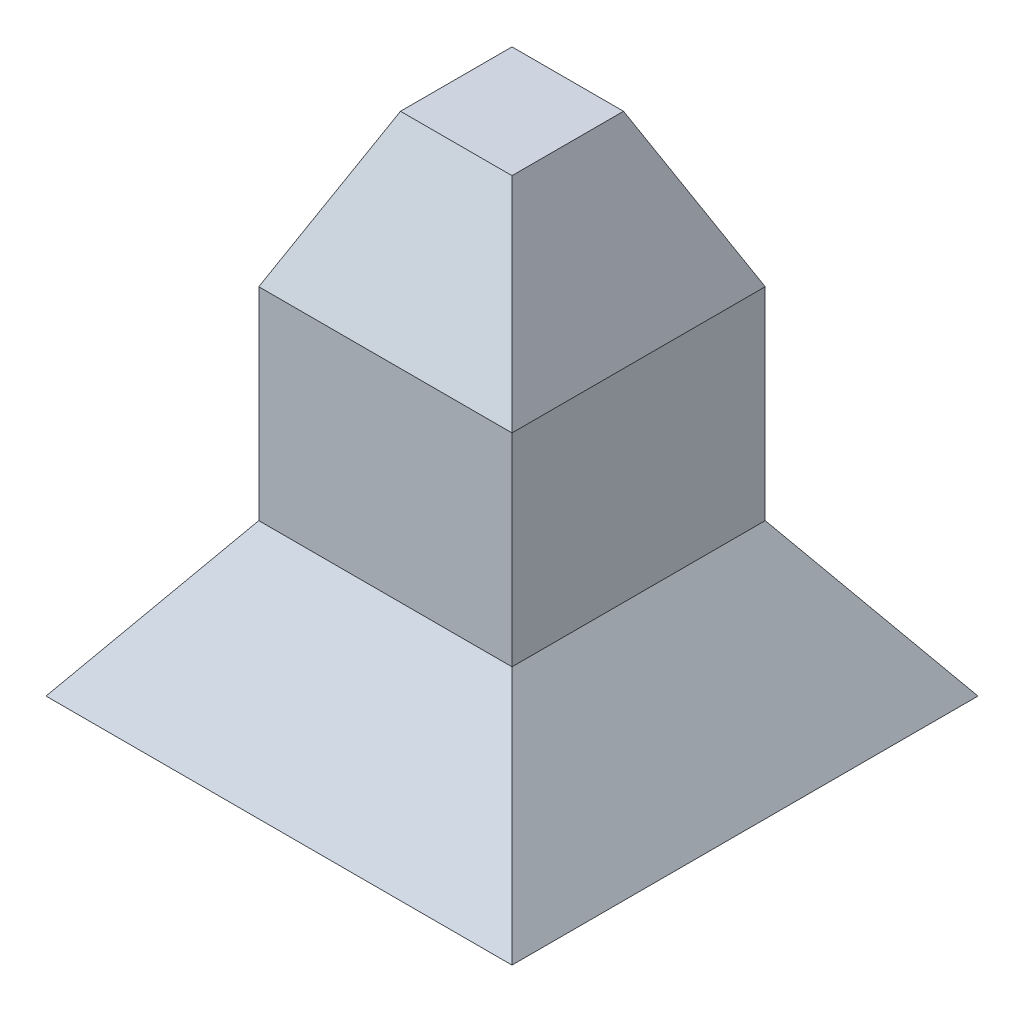
ISO-10303-21;
HEADER;
FILE_DESCRIPTION(('STEP AP214'),'2;1');
FILE_NAME('part.step','',(''),(''),'','','');
FILE_SCHEMA(('AUTOMOTIVE_DESIGN { 1 0 10303 214 1 1 1 1 }'));
ENDSEC;
DATA;
#1=APPLICATION_CONTEXT('core data for automotive mechanical design processes');
#2=APPLICATION_PROTOCOL_DEFINITION('international standard','automotive_design',2000,#1);
#3=PRODUCT_CONTEXT('',#1,'mechanical');
#4=PRODUCT('Part','Part','',(#3));
#5=PRODUCT_RELATED_PRODUCT_CATEGORY('part','',(#4));
#6=PRODUCT_DEFINITION_FORMATION('','',#4);
#7=PRODUCT_DEFINITION_CONTEXT('part definition',#1,'design');
#8=PRODUCT_DEFINITION('design','',#6,#7);
#9=PRODUCT_DEFINITION_SHAPE('','',#8);
#10=(LENGTH_UNIT() NAMED_UNIT(*) SI_UNIT(.MILLI.,.METRE.));
#11=(NAMED_UNIT(*) PLANE_ANGLE_UNIT() SI_UNIT($,.RADIAN.));
#12=(NAMED_UNIT(*) SI_UNIT($,.STERADIAN.) SOLID_ANGLE_UNIT());
#13=UNCERTAINTY_MEASURE_WITH_UNIT(LENGTH_MEASURE(1.E-05),#10,'distance_accuracy_value','');
#14=(GEOMETRIC_REPRESENTATION_CONTEXT(3) GLOBAL_UNCERTAINTY_ASSIGNED_CONTEXT((#13)) GLOBAL_UNIT_ASSIGNED_CONTEXT((#10,
#11,#12)) REPRESENTATION_CONTEXT('',''));
#15=CARTESIAN_POINT('',(0.,0.,0.));
#16=DIRECTION('',(0.,0.,1.));
#17=DIRECTION('',(1.,0.,0.));
#18=AXIS2_PLACEMENT_3D('',#15,#16,#17);
#19=CARTESIAN_POINT('',(-50.,80.,-49.9999999999998));
#20=DIRECTION('',(0.,0.,1.));
#21=DIRECTION('',(1.,0.,0.));
#22=AXIS2_PLACEMENT_3D('',#19,#20,#21);
#23=PLANE('',#22);
#24=DIRECTION('',(-1.,0.,0.));
#25=VECTOR('',#24,1.);
#26=CARTESIAN_POINT('',(-50.,0.,-49.9999999999998));
#27=LINE('',#26,#25);
#28=CARTESIAN_POINT('',(50.,0.,-49.9999999999998));
#29=VERTEX_POINT('',#28);
#30=CARTESIAN_POINT('',(-50.,0.,-49.9999999999998));
#31=VERTEX_POINT('',#30);
#32=EDGE_CURVE('E243',#29,#31,#27,.T.);
#33=ORIENTED_EDGE('',*,*,#32,.T.);
#34=DIRECTION('',(0.,-1.,0.));
#35=VECTOR('',#34,1.);
#36=CARTESIAN_POINT('',(-50.,80.,-49.9999999999998));
#37=LINE('',#36,#35);
#38=CARTESIAN_POINT('',(-50.,80.,-49.9999999999998));
#39=VERTEX_POINT('',#38);
#40=EDGE_CURVE('E43',#39,#31,#37,.T.);
#41=ORIENTED_EDGE('',*,*,#40,.F.);
#42=DIRECTION('',(-1.,0.,0.));
#43=VECTOR('',#42,1.);
#44=CARTESIAN_POINT('',(-50.,80.,-49.9999999999998));
#45=LINE('',#44,#43);
#46=CARTESIAN_POINT('',(50.,80.,-49.9999999999998));
#47=VERTEX_POINT('',#46);
#48=EDGE_CURVE('E230',#47,#39,#45,.T.);
#49=ORIENTED_EDGE('',*,*,#48,.F.);
#50=DIRECTION('',(0.,-1.,0.));
#51=VECTOR('',#50,1.);
#52=CARTESIAN_POINT('',(50.,80.,-49.9999999999998));
#53=LINE('',#52,#51);
#54=EDGE_CURVE('E11',#47,#29,#53,.T.);
#55=ORIENTED_EDGE('',*,*,#54,.T.);
#56=EDGE_LOOP('',(#33,#41,#49,#55));
#57=FACE_BOUND('',#56,.T.);
#58=DIRECTION('',(0.,1.,0.));
#59=VECTOR('',#58,1.);
#60=CARTESIAN_POINT('',(-15.,25.,-49.9999999999998));
#61=LINE('',#60,#59);
#62=CARTESIAN_POINT('',(-15.,25.,-49.9999999999998));
#63=VERTEX_POINT('',#62);
#64=CARTESIAN_POINT('',(-15.,55.,-49.9999999999998));
#65=VERTEX_POINT('',#64);
#66=EDGE_CURVE('E69',#63,#65,#61,.T.);
#67=ORIENTED_EDGE('',*,*,#66,.F.);
#68=DIRECTION('',(-1.,0.,0.));
#69=VECTOR('',#68,1.);
#70=CARTESIAN_POINT('',(15.,25.,-49.9999999999998));
#71=LINE('',#70,#69);
#72=CARTESIAN_POINT('',(15.,25.,-49.9999999999998));
#73=VERTEX_POINT('',#72);
#74=EDGE_CURVE('E146',#73,#63,#71,.T.);
#75=ORIENTED_EDGE('',*,*,#74,.F.);
#76=DIRECTION('',(0.,-1.,0.));
#77=VECTOR('',#76,1.);
#78=CARTESIAN_POINT('',(15.,25.,-49.9999999999998));
#79=LINE('',#78,#77);
#80=CARTESIAN_POINT('',(15.,55.,-49.9999999999998));
#81=VERTEX_POINT('',#80);
#82=EDGE_CURVE('E148',#81,#73,#79,.T.);
#83=ORIENTED_EDGE('',*,*,#82,.F.);
#84=DIRECTION('',(1.,0.,0.));
#85=VECTOR('',#84,1.);
#86=CARTESIAN_POINT('',(15.,55.,-49.9999999999998));
#87=LINE('',#86,#85);
#88=EDGE_CURVE('E52',#65,#81,#87,.T.);
#89=ORIENTED_EDGE('',*,*,#88,.F.);
#90=EDGE_LOOP('',(#67,#75,#83,#89));
#91=FACE_BOUND('',#90,.T.);
#92=ADVANCED_FACE('F33',(#57,#91),#23,.F.);
#93=CARTESIAN_POINT('',(50.,80.,50.0000000000003));
#94=DIRECTION('',(-1.,0.,0.));
#95=DIRECTION('',(0.,0.,1.));
#96=AXIS2_PLACEMENT_3D('',#93,#94,#95);
#97=PLANE('',#96);
#98=DIRECTION('',(0.,0.,-1.));
#99=VECTOR('',#98,1.);
#100=CARTESIAN_POINT('',(50.,0.,50.0000000000003));
#101=LINE('',#100,#99);
#102=CARTESIAN_POINT('',(50.,0.,50.0000000000003));
#103=VERTEX_POINT('',#102);
#104=EDGE_CURVE('E209',#103,#29,#101,.T.);
#105=ORIENTED_EDGE('',*,*,#104,.T.);
#106=ORIENTED_EDGE('',*,*,#54,.F.);
#107=DIRECTION('',(0.,0.,-1.));
#108=VECTOR('',#107,1.);
#109=CARTESIAN_POINT('',(50.,80.,50.0000000000003));
#110=LINE('',#109,#108);
#111=CARTESIAN_POINT('',(50.,80.,50.0000000000003));
#112=VERTEX_POINT('',#111);
#113=EDGE_CURVE('E227',#112,#47,#110,.T.);
#114=ORIENTED_EDGE('',*,*,#113,.F.);
#115=DIRECTION('',(0.,-1.,0.));
#116=VECTOR('',#115,1.);
#117=CARTESIAN_POINT('',(50.,80.,50.0000000000003));
#118=LINE('',#117,#116);
#119=EDGE_CURVE('E240',#112,#103,#118,.T.);
#120=ORIENTED_EDGE('',*,*,#119,.T.);
#121=EDGE_LOOP('',(#105,#106,#114,#120));
#122=FACE_BOUND('',#121,.T.);
#123=ADVANCED_FACE('F295',(#122),#97,.F.);
#124=CARTESIAN_POINT('',(-50.,80.,50.0000000000003));
#125=DIRECTION('',(1.,0.,0.));
#126=DIRECTION('',(0.,0.,-1.));
#127=AXIS2_PLACEMENT_3D('',#124,#125,#126);
#128=PLANE('',#127);
#129=DIRECTION('',(0.,0.,1.));
#130=VECTOR('',#129,1.);
#131=CARTESIAN_POINT('',(-50.,0.,50.0000000000003));
#132=LINE('',#131,#130);
#133=CARTESIAN_POINT('',(-50.,0.,50.0000000000003));
#134=VERTEX_POINT('',#133);
#135=EDGE_CURVE('E246',#31,#134,#132,.T.);
#136=ORIENTED_EDGE('',*,*,#135,.T.);
#137=DIRECTION('',(0.,-1.,0.));
#138=VECTOR('',#137,1.);
#139=CARTESIAN_POINT('',(-50.,80.,50.0000000000003));
#140=LINE('',#139,#138);
#141=CARTESIAN_POINT('',(-50.,80.,50.0000000000003));
#142=VERTEX_POINT('',#141);
#143=EDGE_CURVE('E253',#142,#134,#140,.T.);
#144=ORIENTED_EDGE('',*,*,#143,.F.);
#145=DIRECTION('',(0.,0.,1.));
#146=VECTOR('',#145,1.);
#147=CARTESIAN_POINT('',(-50.,80.,50.0000000000003));
#148=LINE('',#147,#146);
#149=EDGE_CURVE('E234',#39,#142,#148,.T.);
#150=ORIENTED_EDGE('',*,*,#149,.F.);
#151=ORIENTED_EDGE('',*,*,#40,.T.);
#152=EDGE_LOOP('',(#136,#144,#150,#151));
#153=FACE_BOUND('',#152,.T.);
#154=ADVANCED_FACE('F301',(#153),#128,.F.);
#155=CARTESIAN_POINT('',(-50.,80.,50.0000000000003));
#156=DIRECTION('',(0.,0.,-1.));
#157=DIRECTION('',(-1.,0.,0.));
#158=AXIS2_PLACEMENT_3D('',#155,#156,#157);
#159=PLANE('',#158);
#160=DIRECTION('',(1.,0.,0.));
#161=VECTOR('',#160,1.);
#162=CARTESIAN_POINT('',(-50.,0.,50.0000000000003));
#163=LINE('',#162,#161);
#164=EDGE_CURVE('E231',#134,#103,#163,.T.);
#165=ORIENTED_EDGE('',*,*,#164,.T.);
#166=ORIENTED_EDGE('',*,*,#119,.F.);
#167=DIRECTION('',(1.,0.,0.));
#168=VECTOR('',#167,1.);
#169=CARTESIAN_POINT('',(-50.,80.,50.0000000000003));
#170=LINE('',#169,#168);
#171=EDGE_CURVE('E237',#142,#112,#170,.T.);
#172=ORIENTED_EDGE('',*,*,#171,.F.);
#173=ORIENTED_EDGE('',*,*,#143,.T.);
#174=EDGE_LOOP('',(#165,#166,#172,#173));
#175=FACE_BOUND('',#174,.T.);
#176=ADVANCED_FACE('F371',(#175),#159,.F.);
#177=CARTESIAN_POINT('',(-50.,80.,50.0000000000003));
#178=DIRECTION('',(0.,0.4226182617407,0.90630778703665));
#179=DIRECTION('',(0.,-0.90630778703665,0.4226182617407));
#180=AXIS2_PLACEMENT_3D('',#177,#178,#179);
#181=PLANE('',#180);
#182=ORIENTED_EDGE('',*,*,#171,.T.);
#183=DIRECTION('',(0.389281620635026,-0.834817129478987,0.389281620635026));
#184=VECTOR('',#183,1.);
#185=CARTESIAN_POINT('',(50.,80.,50.0000000000003));
#186=LINE('',#185,#184);
#187=CARTESIAN_POINT('',(22.0215405107,140.,22.0215405107003));
#188=VERTEX_POINT('',#187);
#189=EDGE_CURVE('E206',#188,#112,#186,.T.);
#190=ORIENTED_EDGE('',*,*,#189,.F.);
#191=DIRECTION('',(-1.,0.,0.));
#192=VECTOR('',#191,1.);
#193=CARTESIAN_POINT('',(-50.,140.,22.0215405107003));
#194=LINE('',#193,#192);
#195=CARTESIAN_POINT('',(-22.0215405107,140.,22.0215405107003));
#196=VERTEX_POINT('',#195);
#197=EDGE_CURVE('E187',#196,#188,#194,.F.);
#198=ORIENTED_EDGE('',*,*,#197,.F.);
#199=DIRECTION('',(-0.389281620635026,-0.834817129478987,0.389281620635026));
#200=VECTOR('',#199,1.);
#201=CARTESIAN_POINT('',(-50.,80.,50.0000000000003));
#202=LINE('',#201,#200);
#203=EDGE_CURVE('E211',#196,#142,#202,.T.);
#204=ORIENTED_EDGE('',*,*,#203,.T.);
#205=EDGE_LOOP('',(#182,#190,#198,#204));
#206=FACE_BOUND('',#205,.T.);
#207=ADVANCED_FACE('F367',(#206),#181,.T.);
#208=CARTESIAN_POINT('',(50.,80.,50.0000000000003));
#209=DIRECTION('',(0.90630778703665,0.4226182617407,0.));
#210=DIRECTION('',(-0.4226182617407,0.90630778703665,0.));
#211=AXIS2_PLACEMENT_3D('',#208,#209,#210);
#212=PLANE('',#211);
#213=ORIENTED_EDGE('',*,*,#113,.T.);
#214=DIRECTION('',(0.389281620635026,-0.834817129478987,-0.389281620635026));
#215=VECTOR('',#214,1.);
#216=CARTESIAN_POINT('',(50.,80.,-49.9999999999998));
#217=LINE('',#216,#215);
#218=CARTESIAN_POINT('',(22.0215405107,140.,-22.0215405106998));
#219=VERTEX_POINT('',#218);
#220=EDGE_CURVE('E210',#219,#47,#217,.T.);
#221=ORIENTED_EDGE('',*,*,#220,.F.);
#222=DIRECTION('',(0.,0.,1.));
#223=VECTOR('',#222,1.);
#224=CARTESIAN_POINT('',(22.0215405107,140.,50.0000000000003));
#225=LINE('',#224,#223);
#226=EDGE_CURVE('E222',#188,#219,#225,.F.);
#227=ORIENTED_EDGE('',*,*,#226,.F.);
#228=ORIENTED_EDGE('',*,*,#189,.T.);
#229=EDGE_LOOP('',(#213,#221,#227,#228));
#230=FACE_BOUND('',#229,.T.);
#231=ADVANCED_FACE('F370',(#230),#212,.T.);
#232=CARTESIAN_POINT('',(50.,80.,-49.9999999999998));
#233=DIRECTION('',(0.,0.4226182617407,-0.90630778703665));
#234=DIRECTION('',(0.,0.90630778703665,0.4226182617407));
#235=AXIS2_PLACEMENT_3D('',#232,#233,#234);
#236=PLANE('',#235);
#237=ORIENTED_EDGE('',*,*,#48,.T.);
#238=DIRECTION('',(-0.389281620635026,-0.834817129478987,-0.389281620635026));
#239=VECTOR('',#238,1.);
#240=CARTESIAN_POINT('',(-50.,80.,-49.9999999999998));
#241=LINE('',#240,#239);
#242=CARTESIAN_POINT('',(-22.0215405107,140.,-22.0215405106998));
#243=VERTEX_POINT('',#242);
#244=EDGE_CURVE('E214',#243,#39,#241,.T.);
#245=ORIENTED_EDGE('',*,*,#244,.F.);
#246=DIRECTION('',(1.,0.,0.));
#247=VECTOR('',#246,1.);
#248=CARTESIAN_POINT('',(50.,140.,-22.0215405106998));
#249=LINE('',#248,#247);
#250=EDGE_CURVE('E224',#219,#243,#249,.F.);
#251=ORIENTED_EDGE('',*,*,#250,.F.);
#252=ORIENTED_EDGE('',*,*,#220,.T.);
#253=EDGE_LOOP('',(#237,#245,#251,#252));
#254=FACE_BOUND('',#253,.T.);
#255=ADVANCED_FACE('F375',(#254),#236,.T.);
#256=CARTESIAN_POINT('',(-50.,80.,-49.9999999999998));
#257=DIRECTION('',(-0.90630778703665,0.4226182617407,0.));
#258=DIRECTION('',(-0.4226182617407,-0.90630778703665,0.));
#259=AXIS2_PLACEMENT_3D('',#256,#257,#258);
#260=PLANE('',#259);
#261=ORIENTED_EDGE('',*,*,#149,.T.);
#262=ORIENTED_EDGE('',*,*,#203,.F.);
#263=DIRECTION('',(0.,0.,-1.));
#264=VECTOR('',#263,1.);
#265=CARTESIAN_POINT('',(-22.0215405107,140.,-49.9999999999998));
#266=LINE('',#265,#264);
#267=EDGE_CURVE('E215',#243,#196,#266,.F.);
#268=ORIENTED_EDGE('',*,*,#267,.F.);
#269=ORIENTED_EDGE('',*,*,#244,.T.);
#270=EDGE_LOOP('',(#261,#262,#268,#269));
#271=FACE_BOUND('',#270,.T.);
#272=ADVANCED_FACE('F365',(#271),#260,.T.);
#273=CARTESIAN_POINT('',(0.,140.,0.));
#274=DIRECTION('',(0.,1.,0.));
#275=DIRECTION('',(0.,0.,1.));
#276=AXIS2_PLACEMENT_3D('',#273,#274,#275);
#277=PLANE('',#276);
#278=ORIENTED_EDGE('',*,*,#197,.T.);
#279=ORIENTED_EDGE('',*,*,#226,.T.);
#280=ORIENTED_EDGE('',*,*,#250,.T.);
#281=ORIENTED_EDGE('',*,*,#267,.T.);
#282=EDGE_LOOP('',(#278,#279,#280,#281));
#283=FACE_BOUND('',#282,.T.);
#284=ADVANCED_FACE('F351',(#283),#277,.T.);
#285=CARTESIAN_POINT('',(-50.,0.,-49.9999999999998));
#286=DIRECTION('',(0.,0.573576436351047,-0.819152044288991));
#287=DIRECTION('',(0.,0.819152044288991,0.573576436351047));
#288=AXIS2_PLACEMENT_3D('',#285,#286,#287);
#289=PLANE('',#288);
#290=ORIENTED_EDGE('',*,*,#32,.F.);
#291=DIRECTION('',(-0.497542812164524,0.710564775461629,0.497542812164524));
#292=VECTOR('',#291,1.);
#293=CARTESIAN_POINT('',(50.,0.,-49.9999999999998));
#294=LINE('',#293,#292);
#295=CARTESIAN_POINT('',(92.0124522925827,-60.,-92.0124522925825));
#296=VERTEX_POINT('',#295);
#297=EDGE_CURVE('E185',#296,#29,#294,.T.);
#298=ORIENTED_EDGE('',*,*,#297,.F.);
#299=DIRECTION('',(-1.,0.,0.));
#300=VECTOR('',#299,1.);
#301=CARTESIAN_POINT('',(-50.,-60.,-92.0124522925825));
#302=LINE('',#301,#300);
#303=CARTESIAN_POINT('',(-92.0124522925828,-60.,-92.0124522925825));
#304=VERTEX_POINT('',#303);
#305=EDGE_CURVE('E197',#304,#296,#302,.F.);
#306=ORIENTED_EDGE('',*,*,#305,.F.);
#307=DIRECTION('',(0.497542812164524,0.710564775461629,0.497542812164524));
#308=VECTOR('',#307,1.);
#309=CARTESIAN_POINT('',(-50.,0.,-49.9999999999998));
#310=LINE('',#309,#308);
#311=EDGE_CURVE('E189',#304,#31,#310,.T.);
#312=ORIENTED_EDGE('',*,*,#311,.T.);
#313=EDGE_LOOP('',(#290,#298,#306,#312));
#314=FACE_BOUND('',#313,.T.);
#315=ADVANCED_FACE('F347',(#314),#289,.T.);
#316=CARTESIAN_POINT('',(50.,0.,-49.9999999999998));
#317=DIRECTION('',(0.819152044288991,0.573576436351047,0.));
#318=DIRECTION('',(-0.573576436351047,0.819152044288991,0.));
#319=AXIS2_PLACEMENT_3D('',#316,#317,#318);
#320=PLANE('',#319);
#321=ORIENTED_EDGE('',*,*,#104,.F.);
#322=DIRECTION('',(-0.497542812164524,0.710564775461629,-0.497542812164524));
#323=VECTOR('',#322,1.);
#324=CARTESIAN_POINT('',(50.,0.,50.0000000000003));
#325=LINE('',#324,#323);
#326=CARTESIAN_POINT('',(92.0124522925827,-60.,92.012452292583));
#327=VERTEX_POINT('',#326);
#328=EDGE_CURVE('E188',#327,#103,#325,.T.);
#329=ORIENTED_EDGE('',*,*,#328,.F.);
#330=DIRECTION('',(0.,0.,-1.));
#331=VECTOR('',#330,1.);
#332=CARTESIAN_POINT('',(92.0124522925827,-60.,-49.9999999999998));
#333=LINE('',#332,#331);
#334=EDGE_CURVE('E200',#296,#327,#333,.F.);
#335=ORIENTED_EDGE('',*,*,#334,.F.);
#336=ORIENTED_EDGE('',*,*,#297,.T.);
#337=EDGE_LOOP('',(#321,#329,#335,#336));
#338=FACE_BOUND('',#337,.T.);
#339=ADVANCED_FACE('F350',(#338),#320,.T.);
#340=CARTESIAN_POINT('',(50.,0.,50.0000000000003));
#341=DIRECTION('',(0.,0.573576436351047,0.819152044288991));
#342=DIRECTION('',(0.,-0.819152044288991,0.573576436351047));
#343=AXIS2_PLACEMENT_3D('',#340,#341,#342);
#344=PLANE('',#343);
#345=ORIENTED_EDGE('',*,*,#164,.F.);
#346=DIRECTION('',(0.497542812164524,0.710564775461629,-0.497542812164524));
#347=VECTOR('',#346,1.);
#348=CARTESIAN_POINT('',(-50.,0.,50.0000000000003));
#349=LINE('',#348,#347);
#350=CARTESIAN_POINT('',(-92.0124522925828,-60.,92.012452292583));
#351=VERTEX_POINT('',#350);
#352=EDGE_CURVE('E191',#351,#134,#349,.T.);
#353=ORIENTED_EDGE('',*,*,#352,.F.);
#354=DIRECTION('',(1.,0.,0.));
#355=VECTOR('',#354,1.);
#356=CARTESIAN_POINT('',(50.,-60.,92.012452292583));
#357=LINE('',#356,#355);
#358=EDGE_CURVE('E203',#327,#351,#357,.F.);
#359=ORIENTED_EDGE('',*,*,#358,.F.);
#360=ORIENTED_EDGE('',*,*,#328,.T.);
#361=EDGE_LOOP('',(#345,#353,#359,#360));
#362=FACE_BOUND('',#361,.T.);
#363=ADVANCED_FACE('F355',(#362),#344,.T.);
#364=CARTESIAN_POINT('',(-50.,0.,50.0000000000003));
#365=DIRECTION('',(-0.819152044288991,0.573576436351047,0.));
#366=DIRECTION('',(-0.573576436351047,-0.819152044288991,0.));
#367=AXIS2_PLACEMENT_3D('',#364,#365,#366);
#368=PLANE('',#367);
#369=ORIENTED_EDGE('',*,*,#135,.F.);
#370=ORIENTED_EDGE('',*,*,#311,.F.);
#371=DIRECTION('',(0.,0.,1.));
#372=VECTOR('',#371,1.);
#373=CARTESIAN_POINT('',(-92.0124522925828,-60.,50.0000000000003));
#374=LINE('',#373,#372);
#375=EDGE_CURVE('E192',#351,#304,#374,.F.);
#376=ORIENTED_EDGE('',*,*,#375,.F.);
#377=ORIENTED_EDGE('',*,*,#352,.T.);
#378=EDGE_LOOP('',(#369,#370,#376,#377));
#379=FACE_BOUND('',#378,.T.);
#380=ADVANCED_FACE('F346',(#379),#368,.T.);
#381=CARTESIAN_POINT('',(0.,-60.,0.));
#382=DIRECTION('',(0.,-1.,0.));
#383=DIRECTION('',(0.,0.,-1.));
#384=AXIS2_PLACEMENT_3D('',#381,#382,#383);
#385=PLANE('',#384);
#386=DIRECTION('',(0.,0.,-1.));
#387=VECTOR('',#386,1.);
#388=CARTESIAN_POINT('',(86.0166030567772,-60.,0.));
#389=LINE('',#388,#387);
#390=CARTESIAN_POINT('',(86.0166030567772,-60.,-86.0166030567772));
#391=VERTEX_POINT('',#390);
#392=CARTESIAN_POINT('',(86.0166030567772,-60.,86.0166030567772));
#393=VERTEX_POINT('',#392);
#394=EDGE_CURVE('E273',#391,#393,#389,.F.);
#395=ORIENTED_EDGE('',*,*,#394,.F.);
#396=DIRECTION('',(-1.,0.,0.));
#397=VECTOR('',#396,1.);
#398=CARTESIAN_POINT('',(0.,-60.,-86.0166030567772));
#399=LINE('',#398,#397);
#400=CARTESIAN_POINT('',(-86.0166030567772,-60.,-86.0166030567772));
#401=VERTEX_POINT('',#400);
#402=EDGE_CURVE('E175',#401,#391,#399,.F.);
#403=ORIENTED_EDGE('',*,*,#402,.F.);
#404=DIRECTION('',(0.,0.,1.));
#405=VECTOR('',#404,1.);
#406=CARTESIAN_POINT('',(-86.0166030567772,-60.,0.));
#407=LINE('',#406,#405);
#408=CARTESIAN_POINT('',(-86.0166030567772,-60.,86.0166030567772));
#409=VERTEX_POINT('',#408);
#410=EDGE_CURVE('E267',#409,#401,#407,.F.);
#411=ORIENTED_EDGE('',*,*,#410,.F.);
#412=DIRECTION('',(1.,0.,0.));
#413=VECTOR('',#412,1.);
#414=CARTESIAN_POINT('',(0.,-60.,86.0166030567772));
#415=LINE('',#414,#413);
#416=EDGE_CURVE('E270',#393,#409,#415,.F.);
#417=ORIENTED_EDGE('',*,*,#416,.F.);
#418=EDGE_LOOP('',(#395,#403,#411,#417));
#419=FACE_BOUND('',#418,.T.);
#420=ORIENTED_EDGE('',*,*,#305,.T.);
#421=ORIENTED_EDGE('',*,*,#334,.T.);
#422=ORIENTED_EDGE('',*,*,#358,.T.);
#423=ORIENTED_EDGE('',*,*,#375,.T.);
#424=EDGE_LOOP('',(#420,#421,#422,#423));
#425=FACE_BOUND('',#424,.T.);
#426=ADVANCED_FACE('F315',(#419,#425),#385,.T.);
#427=CARTESIAN_POINT('',(72.012452292583,-40.,-72.012452292583));
#428=DIRECTION('',(-0.819152044288991,-0.573576436351047,0.));
#429=DIRECTION('',(0.573576436351047,-0.819152044288991,0.));
#430=AXIS2_PLACEMENT_3D('',#427,#428,#429);
#431=PLANE('',#430);
#432=ORIENTED_EDGE('',*,*,#394,.T.);
#433=DIRECTION('',(0.497542812164524,-0.710564775461629,0.497542812164524));
#434=VECTOR('',#433,1.);
#435=CARTESIAN_POINT('',(36.3592528002991,10.918045788884,36.3592528002991));
#436=LINE('',#435,#434);
#437=CARTESIAN_POINT('',(72.012452292583,-40.,72.012452292583));
#438=VERTEX_POINT('',#437);
#439=EDGE_CURVE('E184',#438,#393,#436,.T.);
#440=ORIENTED_EDGE('',*,*,#439,.F.);
#441=DIRECTION('',(0.,0.,1.));
#442=VECTOR('',#441,1.);
#443=CARTESIAN_POINT('',(72.012452292583,-40.,-72.012452292583));
#444=LINE('',#443,#442);
#445=CARTESIAN_POINT('',(72.012452292583,-40.,-72.012452292583));
#446=VERTEX_POINT('',#445);
#447=EDGE_CURVE('E171',#446,#438,#444,.T.);
#448=ORIENTED_EDGE('',*,*,#447,.F.);
#449=DIRECTION('',(0.497542812164524,-0.710564775461629,-0.497542812164524));
#450=VECTOR('',#449,1.);
#451=CARTESIAN_POINT('',(36.3592528002991,10.918045788884,-36.3592528002991));
#452=LINE('',#451,#450);
#453=EDGE_CURVE('E201',#446,#391,#452,.T.);
#454=ORIENTED_EDGE('',*,*,#453,.T.);
#455=EDGE_LOOP('',(#432,#440,#448,#454));
#456=FACE_BOUND('',#455,.T.);
#457=ADVANCED_FACE('F311',(#456),#431,.T.);
#458=CARTESIAN_POINT('',(-72.012452292583,-40.,-72.012452292583));
#459=DIRECTION('',(0.,-0.573576436351047,0.819152044288991));
#460=DIRECTION('',(0.,-0.819152044288991,-0.573576436351047));
#461=AXIS2_PLACEMENT_3D('',#458,#459,#460);
#462=PLANE('',#461);
#463=ORIENTED_EDGE('',*,*,#402,.T.);
#464=ORIENTED_EDGE('',*,*,#453,.F.);
#465=DIRECTION('',(1.,0.,0.));
#466=VECTOR('',#465,1.);
#467=CARTESIAN_POINT('',(-72.012452292583,-40.,-72.012452292583));
#468=LINE('',#467,#466);
#469=CARTESIAN_POINT('',(-72.012452292583,-40.,-72.012452292583));
#470=VERTEX_POINT('',#469);
#471=EDGE_CURVE('E181',#470,#446,#468,.T.);
#472=ORIENTED_EDGE('',*,*,#471,.F.);
#473=DIRECTION('',(-0.497542812164524,-0.710564775461629,-0.497542812164524));
#474=VECTOR('',#473,1.);
#475=CARTESIAN_POINT('',(-72.012452292583,-40.,-72.012452292583));
#476=LINE('',#475,#474);
#477=EDGE_CURVE('E259',#470,#401,#476,.T.);
#478=ORIENTED_EDGE('',*,*,#477,.T.);
#479=EDGE_LOOP('',(#463,#464,#472,#478));
#480=FACE_BOUND('',#479,.T.);
#481=ADVANCED_FACE('F307',(#480),#462,.T.);
#482=CARTESIAN_POINT('',(-72.012452292583,-40.,-72.012452292583));
#483=DIRECTION('',(0.819152044288991,-0.573576436351047,0.));
#484=DIRECTION('',(0.573576436351047,0.819152044288991,0.));
#485=AXIS2_PLACEMENT_3D('',#482,#483,#484);
#486=PLANE('',#485);
#487=ORIENTED_EDGE('',*,*,#410,.T.);
#488=ORIENTED_EDGE('',*,*,#477,.F.);
#489=DIRECTION('',(0.,0.,-1.));
#490=VECTOR('',#489,1.);
#491=CARTESIAN_POINT('',(-72.012452292583,-40.,-72.012452292583));
#492=LINE('',#491,#490);
#493=CARTESIAN_POINT('',(-72.012452292583,-40.,72.012452292583));
#494=VERTEX_POINT('',#493);
#495=EDGE_CURVE('E178',#494,#470,#492,.T.);
#496=ORIENTED_EDGE('',*,*,#495,.F.);
#497=DIRECTION('',(-0.497542812164524,-0.710564775461629,0.497542812164524));
#498=VECTOR('',#497,1.);
#499=CARTESIAN_POINT('',(-72.012452292583,-40.,72.012452292583));
#500=LINE('',#499,#498);
#501=EDGE_CURVE('E261',#494,#409,#500,.T.);
#502=ORIENTED_EDGE('',*,*,#501,.T.);
#503=EDGE_LOOP('',(#487,#488,#496,#502));
#504=FACE_BOUND('',#503,.T.);
#505=ADVANCED_FACE('F310',(#504),#486,.T.);
#506=CARTESIAN_POINT('',(-72.012452292583,-40.,72.012452292583));
#507=DIRECTION('',(0.,-0.573576436351047,-0.819152044288991));
#508=DIRECTION('',(0.,0.819152044288991,-0.573576436351047));
#509=AXIS2_PLACEMENT_3D('',#506,#507,#508);
#510=PLANE('',#509);
#511=ORIENTED_EDGE('',*,*,#416,.T.);
#512=ORIENTED_EDGE('',*,*,#501,.F.);
#513=DIRECTION('',(-1.,0.,0.));
#514=VECTOR('',#513,1.);
#515=CARTESIAN_POINT('',(-72.012452292583,-40.,72.012452292583));
#516=LINE('',#515,#514);
#517=EDGE_CURVE('E174',#438,#494,#516,.T.);
#518=ORIENTED_EDGE('',*,*,#517,.F.);
#519=ORIENTED_EDGE('',*,*,#439,.T.);
#520=EDGE_LOOP('',(#511,#512,#518,#519));
#521=FACE_BOUND('',#520,.T.);
#522=ADVANCED_FACE('F317',(#521),#510,.T.);
#523=CARTESIAN_POINT('',(0.,-40.,0.));
#524=DIRECTION('',(0.,1.,0.));
#525=DIRECTION('',(0.,0.,1.));
#526=AXIS2_PLACEMENT_3D('',#523,#524,#525);
#527=PLANE('',#526);
#528=ORIENTED_EDGE('',*,*,#447,.T.);
#529=ORIENTED_EDGE('',*,*,#517,.T.);
#530=ORIENTED_EDGE('',*,*,#495,.T.);
#531=ORIENTED_EDGE('',*,*,#471,.T.);
#532=EDGE_LOOP('',(#528,#529,#530,#531));
#533=FACE_BOUND('',#532,.T.);
#534=ADVANCED_FACE('F319',(#533),#527,.F.);
#535=CARTESIAN_POINT('',(-15.,25.,-69.9999999999998));
#536=DIRECTION('',(1.,0.,0.));
#537=DIRECTION('',(0.,0.,-1.));
#538=AXIS2_PLACEMENT_3D('',#535,#536,#537);
#539=PLANE('',#538);
#540=ORIENTED_EDGE('',*,*,#66,.T.);
#541=DIRECTION('',(0.,-0.342020143325669,-0.939692620785908));
#542=VECTOR('',#541,1.);
#543=CARTESIAN_POINT('',(-15.,55.,-49.9999999999998));
#544=LINE('',#543,#542);
#545=CARTESIAN_POINT('',(-15.,47.7205953146759,-69.9999999999998));
#546=VERTEX_POINT('',#545);
#547=EDGE_CURVE('E168',#546,#65,#544,.F.);
#548=ORIENTED_EDGE('',*,*,#547,.F.);
#549=DIRECTION('',(0.,1.,0.));
#550=VECTOR('',#549,1.);
#551=CARTESIAN_POINT('',(-15.,25.,-69.9999999999998));
#552=LINE('',#551,#550);
#553=CARTESIAN_POINT('',(-15.,25.,-69.9999999999998));
#554=VERTEX_POINT('',#553);
#555=EDGE_CURVE('E153',#554,#546,#552,.T.);
#556=ORIENTED_EDGE('',*,*,#555,.F.);
#557=DIRECTION('',(0.,0.,1.));
#558=VECTOR('',#557,1.);
#559=CARTESIAN_POINT('',(-15.,25.,-69.9999999999998));
#560=LINE('',#559,#558);
#561=EDGE_CURVE('E166',#554,#63,#560,.T.);
#562=ORIENTED_EDGE('',*,*,#561,.T.);
#563=EDGE_LOOP('',(#540,#548,#556,#562));
#564=FACE_BOUND('',#563,.T.);
#565=ADVANCED_FACE('F286',(#564),#539,.F.);
#566=CARTESIAN_POINT('',(15.,55.,-49.9999999999998));
#567=DIRECTION('',(0.,0.939692620785908,-0.342020143325669));
#568=DIRECTION('',(0.,0.342020143325669,0.939692620785908));
#569=AXIS2_PLACEMENT_3D('',#566,#567,#568);
#570=PLANE('',#569);
#571=ORIENTED_EDGE('',*,*,#88,.T.);
#572=DIRECTION('',(0.,-0.342020143325669,-0.939692620785908));
#573=VECTOR('',#572,1.);
#574=CARTESIAN_POINT('',(15.,45.0627905499192,-77.3022585764877));
#575=LINE('',#574,#573);
#576=CARTESIAN_POINT('',(15.,47.7205953146759,-69.9999999999998));
#577=VERTEX_POINT('',#576);
#578=EDGE_CURVE('E37',#577,#81,#575,.F.);
#579=ORIENTED_EDGE('',*,*,#578,.F.);
#580=DIRECTION('',(-1.,0.,0.));
#581=VECTOR('',#580,1.);
#582=CARTESIAN_POINT('',(0.,47.7205953146759,-69.9999999999998));
#583=LINE('',#582,#581);
#584=EDGE_CURVE('E63',#546,#577,#583,.F.);
#585=ORIENTED_EDGE('',*,*,#584,.F.);
#586=ORIENTED_EDGE('',*,*,#547,.T.);
#587=EDGE_LOOP('',(#571,#579,#585,#586));
#588=FACE_BOUND('',#587,.T.);
#589=ADVANCED_FACE('F35',(#588),#570,.T.);
#590=CARTESIAN_POINT('',(15.,25.,-69.9999999999998));
#591=DIRECTION('',(-1.,0.,0.));
#592=DIRECTION('',(0.,0.,1.));
#593=AXIS2_PLACEMENT_3D('',#590,#591,#592);
#594=PLANE('',#593);
#595=ORIENTED_EDGE('',*,*,#82,.T.);
#596=DIRECTION('',(0.,0.,1.));
#597=VECTOR('',#596,1.);
#598=CARTESIAN_POINT('',(15.,25.,-69.9999999999998));
#599=LINE('',#598,#597);
#600=CARTESIAN_POINT('',(15.,25.,-69.9999999999998));
#601=VERTEX_POINT('',#600);
#602=EDGE_CURVE('E160',#601,#73,#599,.T.);
#603=ORIENTED_EDGE('',*,*,#602,.F.);
#604=DIRECTION('',(0.,-1.,0.));
#605=VECTOR('',#604,1.);
#606=CARTESIAN_POINT('',(15.,25.,-69.9999999999998));
#607=LINE('',#606,#605);
#608=EDGE_CURVE('E275',#577,#601,#607,.T.);
#609=ORIENTED_EDGE('',*,*,#608,.F.);
#610=ORIENTED_EDGE('',*,*,#578,.T.);
#611=EDGE_LOOP('',(#595,#603,#609,#610));
#612=FACE_BOUND('',#611,.T.);
#613=ADVANCED_FACE('F158',(#612),#594,.F.);
#614=CARTESIAN_POINT('',(15.,25.,-69.9999999999998));
#615=DIRECTION('',(0.,1.,0.));
#616=DIRECTION('',(0.,0.,1.));
#617=AXIS2_PLACEMENT_3D('',#614,#615,#616);
#618=PLANE('',#617);
#619=ORIENTED_EDGE('',*,*,#74,.T.);
#620=ORIENTED_EDGE('',*,*,#561,.F.);
#621=DIRECTION('',(-1.,0.,0.));
#622=VECTOR('',#621,1.);
#623=CARTESIAN_POINT('',(15.,25.,-69.9999999999998));
#624=LINE('',#623,#622);
#625=EDGE_CURVE('E165',#601,#554,#624,.T.);
#626=ORIENTED_EDGE('',*,*,#625,.F.);
#627=ORIENTED_EDGE('',*,*,#602,.T.);
#628=EDGE_LOOP('',(#619,#620,#626,#627));
#629=FACE_BOUND('',#628,.T.);
#630=ADVANCED_FACE('F163',(#629),#618,.F.);
#631=CARTESIAN_POINT('',(0.,0.,-69.9999999999998));
#632=DIRECTION('',(0.,0.,1.));
#633=DIRECTION('',(1.,0.,0.));
#634=AXIS2_PLACEMENT_3D('',#631,#632,#633);
#635=PLANE('',#634);
#636=ORIENTED_EDGE('',*,*,#555,.T.);
#637=ORIENTED_EDGE('',*,*,#584,.T.);
#638=ORIENTED_EDGE('',*,*,#608,.T.);
#639=ORIENTED_EDGE('',*,*,#625,.T.);
#640=EDGE_LOOP('',(#636,#637,#638,#639));
#641=FACE_BOUND('',#640,.T.);
#642=ADVANCED_FACE('F287',(#641),#635,.F.);
#643=CLOSED_SHELL('',(#92,#123,#154,#176,#207,#231,#255,#272,#284,#315,#339,#363,#380,#426,#457,
#481,#505,#522,#534,#565,#589,#613,#630,#642));
#644=MANIFOLD_SOLID_BREP('B2',#643);
#645=ADVANCED_BREP_SHAPE_REPRESENTATION('',(#18,#644),#14);
#646=SHAPE_DEFINITION_REPRESENTATION(#9,#645);
ENDSEC;
END-ISO-10303-21;
